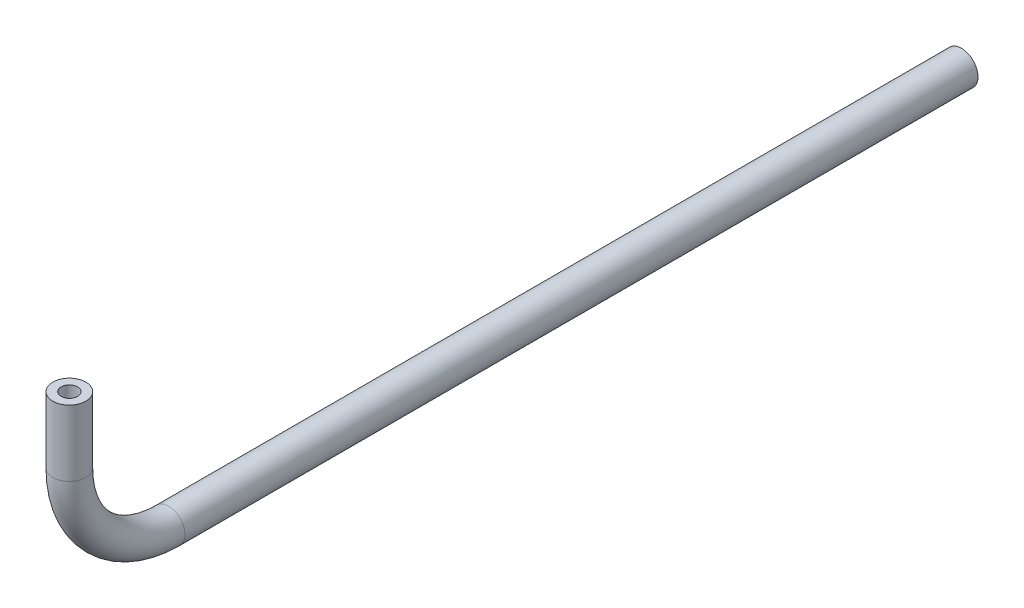
ISO-10303-21;
HEADER;
FILE_DESCRIPTION(('STEP AP214'),'2;1');
FILE_NAME('part.step','',(''),(''),'','','');
FILE_SCHEMA(('AUTOMOTIVE_DESIGN { 1 0 10303 214 1 1 1 1 }'));
ENDSEC;
DATA;
#1=APPLICATION_CONTEXT('core data for automotive mechanical design processes');
#2=APPLICATION_PROTOCOL_DEFINITION('international standard','automotive_design',2000,#1);
#3=PRODUCT_CONTEXT('',#1,'mechanical');
#4=PRODUCT('Part','Part','',(#3));
#5=PRODUCT_RELATED_PRODUCT_CATEGORY('part','',(#4));
#6=PRODUCT_DEFINITION_FORMATION('','',#4);
#7=PRODUCT_DEFINITION_CONTEXT('part definition',#1,'design');
#8=PRODUCT_DEFINITION('design','',#6,#7);
#9=PRODUCT_DEFINITION_SHAPE('','',#8);
#10=(LENGTH_UNIT() NAMED_UNIT(*) SI_UNIT(.MILLI.,.METRE.));
#11=(NAMED_UNIT(*) PLANE_ANGLE_UNIT() SI_UNIT($,.RADIAN.));
#12=(NAMED_UNIT(*) SI_UNIT($,.STERADIAN.) SOLID_ANGLE_UNIT());
#13=UNCERTAINTY_MEASURE_WITH_UNIT(LENGTH_MEASURE(1.E-05),#10,'distance_accuracy_value','');
#14=(GEOMETRIC_REPRESENTATION_CONTEXT(3) GLOBAL_UNCERTAINTY_ASSIGNED_CONTEXT((#13)) GLOBAL_UNIT_ASSIGNED_CONTEXT((#10,
#11,#12)) REPRESENTATION_CONTEXT('',''));
#15=CARTESIAN_POINT('',(0.,0.,0.));
#16=DIRECTION('',(0.,0.,1.));
#17=DIRECTION('',(1.,0.,0.));
#18=AXIS2_PLACEMENT_3D('',#15,#16,#17);
#19=CARTESIAN_POINT('',(0.,12.7,-2.53999999999999));
#20=DIRECTION('',(0.,0.,-1.));
#21=DIRECTION('',(1.,0.,0.));
#22=AXIS2_PLACEMENT_3D('',#19,#20,#21);
#23=PLANE('',#22);
#24=CARTESIAN_POINT('',(0.,12.7,-2.53999999999999));
#25=DIRECTION('',(0.,0.,-1.));
#26=DIRECTION('',(0.,1.,0.));
#27=AXIS2_PLACEMENT_3D('',#24,#25,#26);
#28=CIRCLE('',#27,3.175);
#29=CARTESIAN_POINT('',(0.,15.875,-2.53999999999999));
#30=VERTEX_POINT('',#29);
#31=EDGE_CURVE('E90',#30,#30,#28,.T.);
#32=ORIENTED_EDGE('',*,*,#31,.F.);
#33=EDGE_LOOP('',(#32));
#34=FACE_BOUND('',#33,.T.);
#35=CARTESIAN_POINT('',(0.,12.7,-2.53999999999999));
#36=DIRECTION('',(0.,0.,-1.));
#37=DIRECTION('',(1.,0.,0.));
#38=AXIS2_PLACEMENT_3D('',#35,#36,#37);
#39=CIRCLE('',#38,6.35);
#40=CARTESIAN_POINT('',(6.35000000000001,12.7,-2.53999999999999));
#41=VERTEX_POINT('',#40);
#42=EDGE_CURVE('E84',#41,#41,#39,.T.);
#43=ORIENTED_EDGE('',*,*,#42,.T.);
#44=EDGE_LOOP('',(#43));
#45=FACE_BOUND('',#44,.T.);
#46=ADVANCED_FACE('F65',(#34,#45),#23,.T.);
#47=CARTESIAN_POINT('',(0.,76.1999999999999,340.36));
#48=DIRECTION('',(0.,-1.,0.));
#49=DIRECTION('',(1.,0.,0.));
#50=AXIS2_PLACEMENT_3D('',#47,#48,#49);
#51=PLANE('',#50);
#52=CARTESIAN_POINT('',(0.,76.1999999999999,340.36));
#53=DIRECTION('',(0.,-1.,0.));
#54=DIRECTION('',(1.,0.,0.));
#55=AXIS2_PLACEMENT_3D('',#52,#53,#54);
#56=CIRCLE('',#55,3.175);
#57=CARTESIAN_POINT('',(3.17500000000002,76.1999999999999,340.36));
#58=VERTEX_POINT('',#57);
#59=EDGE_CURVE('E94',#58,#58,#56,.T.);
#60=ORIENTED_EDGE('',*,*,#59,.T.);
#61=EDGE_LOOP('',(#60));
#62=FACE_BOUND('',#61,.T.);
#63=CARTESIAN_POINT('',(0.,76.1999999999999,340.36));
#64=DIRECTION('',(0.,-1.,0.));
#65=DIRECTION('',(1.,0.,0.));
#66=AXIS2_PLACEMENT_3D('',#63,#64,#65);
#67=CIRCLE('',#66,6.35);
#68=CARTESIAN_POINT('',(6.35000000000002,76.1999999999999,340.36));
#69=VERTEX_POINT('',#68);
#70=EDGE_CURVE('E11',#69,#69,#67,.T.);
#71=ORIENTED_EDGE('',*,*,#70,.F.);
#72=EDGE_LOOP('',(#71));
#73=FACE_BOUND('',#72,.T.);
#74=ADVANCED_FACE('F108',(#62,#73),#51,.F.);
#75=CARTESIAN_POINT('',(0.,12.7,-2.53999999999999));
#76=DIRECTION('',(0.,0.,1.));
#77=DIRECTION('',(1.,0.,0.));
#78=AXIS2_PLACEMENT_3D('',#75,#76,#77);
#79=CYLINDRICAL_SURFACE('',#78,6.35);
#80=CARTESIAN_POINT('',(0.,12.7,302.26));
#81=DIRECTION('',(0.,0.,-1.));
#82=DIRECTION('',(1.,0.,0.));
#83=AXIS2_PLACEMENT_3D('',#80,#81,#82);
#84=CIRCLE('',#83,6.35);
#85=CARTESIAN_POINT('',(0.,6.34999999999999,302.26));
#86=VERTEX_POINT('',#85);
#87=EDGE_CURVE('E78',#86,#86,#84,.T.);
#88=ORIENTED_EDGE('',*,*,#87,.T.);
#89=EDGE_LOOP('',(#88));
#90=FACE_BOUND('',#89,.T.);
#91=ORIENTED_EDGE('',*,*,#42,.F.);
#92=EDGE_LOOP('',(#91));
#93=FACE_BOUND('',#92,.T.);
#94=ADVANCED_FACE('F134',(#90,#93),#79,.T.);
#95=CARTESIAN_POINT('',(0.,50.8,302.26));
#96=DIRECTION('',(-1.,0.,0.));
#97=DIRECTION('',(0.,0.,1.));
#98=AXIS2_PLACEMENT_3D('',#95,#96,#97);
#99=TOROIDAL_SURFACE('',#98,38.1,6.35);
#100=CARTESIAN_POINT('',(0.,50.7999999999992,340.36));
#101=DIRECTION('',(0.,-1.,0.));
#102=DIRECTION('',(1.,0.,0.));
#103=AXIS2_PLACEMENT_3D('',#100,#101,#102);
#104=CIRCLE('',#103,6.35);
#105=CARTESIAN_POINT('',(0.,50.7999999999991,346.71));
#106=VERTEX_POINT('',#105);
#107=EDGE_CURVE('E72',#106,#106,#104,.T.);
#108=CARTESIAN_POINT('',(0.,50.8,302.26));
#109=DIRECTION('',(-1.,0.,0.));
#110=DIRECTION('',(0.,0.,1.));
#111=AXIS2_PLACEMENT_3D('',#108,#109,#110);
#112=CIRCLE('',#111,44.45);
#113=EDGE_CURVE('',#86,#106,#112,.T.);
#114=ORIENTED_EDGE('',*,*,#87,.F.);
#115=ORIENTED_EDGE('',*,*,#107,.T.);
#116=ORIENTED_EDGE('',*,*,#113,.T.);
#117=ORIENTED_EDGE('',*,*,#113,.F.);
#118=EDGE_LOOP('',(#114,#116,#115,#117));
#119=FACE_BOUND('',#118,.T.);
#120=ADVANCED_FACE('F136',(#119),#99,.T.);
#121=CARTESIAN_POINT('',(0.,50.8,340.36));
#122=DIRECTION('',(0.,1.,0.));
#123=DIRECTION('',(0.,0.,1.));
#124=AXIS2_PLACEMENT_3D('',#121,#122,#123);
#125=CYLINDRICAL_SURFACE('',#124,6.35);
#126=ORIENTED_EDGE('',*,*,#70,.T.);
#127=EDGE_LOOP('',(#126));
#128=FACE_BOUND('',#127,.T.);
#129=ORIENTED_EDGE('',*,*,#107,.F.);
#130=EDGE_LOOP('',(#129));
#131=FACE_BOUND('',#130,.T.);
#132=ADVANCED_FACE('F126',(#128,#131),#125,.T.);
#133=CARTESIAN_POINT('',(0.,12.7,-5.58799999999997));
#134=DIRECTION('',(0.,0.,1.));
#135=DIRECTION('',(1.,0.,0.));
#136=AXIS2_PLACEMENT_3D('',#133,#134,#135);
#137=CYLINDRICAL_SURFACE('',#136,3.175);
#138=CARTESIAN_POINT('',(0.,12.7,302.26));
#139=DIRECTION('',(0.,0.,-1.));
#140=DIRECTION('',(1.,0.,0.));
#141=AXIS2_PLACEMENT_3D('',#138,#139,#140);
#142=CIRCLE('',#141,3.175);
#143=CARTESIAN_POINT('',(0.,9.52500000000005,302.26));
#144=VERTEX_POINT('',#143);
#145=EDGE_CURVE('E95',#144,#144,#142,.T.);
#146=ORIENTED_EDGE('',*,*,#145,.F.);
#147=EDGE_LOOP('',(#146));
#148=FACE_BOUND('',#147,.T.);
#149=ORIENTED_EDGE('',*,*,#31,.T.);
#150=EDGE_LOOP('',(#149));
#151=FACE_BOUND('',#150,.T.);
#152=ADVANCED_FACE('F116',(#148,#151),#137,.F.);
#153=CARTESIAN_POINT('',(0.,50.8,302.26));
#154=DIRECTION('',(-1.,0.,0.));
#155=DIRECTION('',(0.,0.,1.));
#156=AXIS2_PLACEMENT_3D('',#153,#154,#155);
#157=TOROIDAL_SURFACE('',#156,38.0999999999999,3.175);
#158=CARTESIAN_POINT('',(0.,50.7999999999978,340.36));
#159=DIRECTION('',(0.,-1.,0.));
#160=DIRECTION('',(1.,0.,0.));
#161=AXIS2_PLACEMENT_3D('',#158,#159,#160);
#162=CIRCLE('',#161,3.175);
#163=CARTESIAN_POINT('',(0.,50.7999999999976,343.535));
#164=VERTEX_POINT('',#163);
#165=EDGE_CURVE('E99',#164,#164,#162,.T.);
#166=CARTESIAN_POINT('',(0.,50.8,302.26));
#167=DIRECTION('',(-1.,0.,0.));
#168=DIRECTION('',(0.,0.,1.));
#169=AXIS2_PLACEMENT_3D('',#166,#167,#168);
#170=CIRCLE('',#169,41.2749999999999);
#171=EDGE_CURVE('',#144,#164,#170,.T.);
#172=ORIENTED_EDGE('',*,*,#145,.T.);
#173=ORIENTED_EDGE('',*,*,#165,.F.);
#174=ORIENTED_EDGE('',*,*,#171,.T.);
#175=ORIENTED_EDGE('',*,*,#171,.F.);
#176=EDGE_LOOP('',(#172,#174,#173,#175));
#177=FACE_BOUND('',#176,.T.);
#178=ADVANCED_FACE('F114',(#177),#157,.F.);
#179=CARTESIAN_POINT('',(0.,50.7999999999978,340.36));
#180=DIRECTION('',(0.,1.,0.));
#181=DIRECTION('',(0.,0.,1.));
#182=AXIS2_PLACEMENT_3D('',#179,#180,#181);
#183=CYLINDRICAL_SURFACE('',#182,3.175);
#184=ORIENTED_EDGE('',*,*,#59,.F.);
#185=EDGE_LOOP('',(#184));
#186=FACE_BOUND('',#185,.T.);
#187=ORIENTED_EDGE('',*,*,#165,.T.);
#188=EDGE_LOOP('',(#187));
#189=FACE_BOUND('',#188,.T.);
#190=ADVANCED_FACE('F111',(#186,#189),#183,.F.);
#191=CLOSED_SHELL('',(#46,#74,#94,#120,#132,#152,#178,#190));
#192=MANIFOLD_SOLID_BREP('B2',#191);
#193=ADVANCED_BREP_SHAPE_REPRESENTATION('',(#18,#192),#14);
#194=SHAPE_DEFINITION_REPRESENTATION(#9,#193);
ENDSEC;
END-ISO-10303-21;
